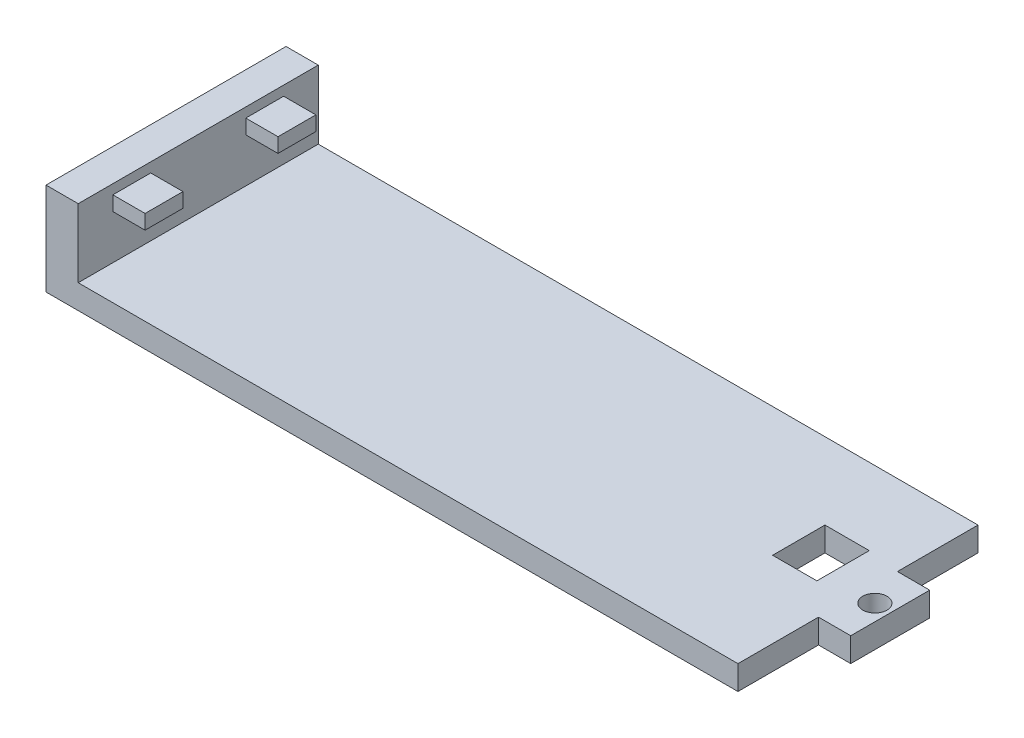
ISO-10303-21;
HEADER;
FILE_DESCRIPTION(('STEP AP214'),'2;1');
FILE_NAME('part.step','',(''),(''),'','','');
FILE_SCHEMA(('AUTOMOTIVE_DESIGN { 1 0 10303 214 1 1 1 1 }'));
ENDSEC;
DATA;
#1=APPLICATION_CONTEXT('core data for automotive mechanical design processes');
#2=APPLICATION_PROTOCOL_DEFINITION('international standard','automotive_design',2000,#1);
#3=PRODUCT_CONTEXT('',#1,'mechanical');
#4=PRODUCT('Part','Part','',(#3));
#5=PRODUCT_RELATED_PRODUCT_CATEGORY('part','',(#4));
#6=PRODUCT_DEFINITION_FORMATION('','',#4);
#7=PRODUCT_DEFINITION_CONTEXT('part definition',#1,'design');
#8=PRODUCT_DEFINITION('design','',#6,#7);
#9=PRODUCT_DEFINITION_SHAPE('','',#8);
#10=(LENGTH_UNIT() NAMED_UNIT(*) SI_UNIT(.MILLI.,.METRE.));
#11=(NAMED_UNIT(*) PLANE_ANGLE_UNIT() SI_UNIT($,.RADIAN.));
#12=(NAMED_UNIT(*) SI_UNIT($,.STERADIAN.) SOLID_ANGLE_UNIT());
#13=UNCERTAINTY_MEASURE_WITH_UNIT(LENGTH_MEASURE(1.E-05),#10,'distance_accuracy_value','');
#14=(GEOMETRIC_REPRESENTATION_CONTEXT(3) GLOBAL_UNCERTAINTY_ASSIGNED_CONTEXT((#13)) GLOBAL_UNIT_ASSIGNED_CONTEXT((#10,
#11,#12)) REPRESENTATION_CONTEXT('',''));
#15=CARTESIAN_POINT('',(0.,0.,0.));
#16=DIRECTION('',(0.,0.,1.));
#17=DIRECTION('',(1.,0.,0.));
#18=AXIS2_PLACEMENT_3D('',#15,#16,#17);
#19=CARTESIAN_POINT('',(4.,11.5,-29.8));
#20=DIRECTION('',(-1.,0.,0.));
#21=DIRECTION('',(0.,0.,1.));
#22=AXIS2_PLACEMENT_3D('',#19,#20,#21);
#23=PLANE('',#22);
#24=DIRECTION('',(0.,-1.,0.));
#25=VECTOR('',#24,1.);
#26=CARTESIAN_POINT('',(4.,8.5,-4.3));
#27=LINE('',#26,#25);
#28=CARTESIAN_POINT('',(4.,10.3,-4.3));
#29=VERTEX_POINT('',#28);
#30=CARTESIAN_POINT('',(4.,8.5,-4.3));
#31=VERTEX_POINT('',#30);
#32=EDGE_CURVE('E202',#29,#31,#27,.T.);
#33=ORIENTED_EDGE('',*,*,#32,.F.);
#34=DIRECTION('',(0.,0.,1.));
#35=VECTOR('',#34,1.);
#36=CARTESIAN_POINT('',(4.,10.3,-4.3));
#37=LINE('',#36,#35);
#38=CARTESIAN_POINT('',(4.,10.3,-9.));
#39=VERTEX_POINT('',#38);
#40=EDGE_CURVE('E215',#39,#29,#37,.T.);
#41=ORIENTED_EDGE('',*,*,#40,.F.);
#42=DIRECTION('',(0.,1.,0.));
#43=VECTOR('',#42,1.);
#44=CARTESIAN_POINT('',(4.,8.5,-9.));
#45=LINE('',#44,#43);
#46=CARTESIAN_POINT('',(4.,8.5,-9.));
#47=VERTEX_POINT('',#46);
#48=EDGE_CURVE('E224',#47,#39,#45,.T.);
#49=ORIENTED_EDGE('',*,*,#48,.F.);
#50=DIRECTION('',(0.,0.,-1.));
#51=VECTOR('',#50,1.);
#52=CARTESIAN_POINT('',(4.,8.5,-4.3));
#53=LINE('',#52,#51);
#54=EDGE_CURVE('E205',#31,#47,#53,.T.);
#55=ORIENTED_EDGE('',*,*,#54,.F.);
#56=EDGE_LOOP('',(#33,#41,#49,#55));
#57=FACE_BOUND('',#56,.T.);
#58=DIRECTION('',(0.,0.,-1.));
#59=VECTOR('',#58,1.);
#60=CARTESIAN_POINT('',(4.,3.,-29.8));
#61=LINE('',#60,#59);
#62=CARTESIAN_POINT('',(4.,3.,0.));
#63=VERTEX_POINT('',#62);
#64=CARTESIAN_POINT('',(4.,3.,-29.8));
#65=VERTEX_POINT('',#64);
#66=EDGE_CURVE('E240',#63,#65,#61,.T.);
#67=ORIENTED_EDGE('',*,*,#66,.T.);
#68=DIRECTION('',(0.,-1.,0.));
#69=VECTOR('',#68,1.);
#70=CARTESIAN_POINT('',(4.,11.5,-29.8));
#71=LINE('',#70,#69);
#72=CARTESIAN_POINT('',(4.,11.5,-29.8));
#73=VERTEX_POINT('',#72);
#74=EDGE_CURVE('E251',#73,#65,#71,.T.);
#75=ORIENTED_EDGE('',*,*,#74,.F.);
#76=DIRECTION('',(0.,0.,-1.));
#77=VECTOR('',#76,1.);
#78=CARTESIAN_POINT('',(4.,11.5,-29.8));
#79=LINE('',#78,#77);
#80=CARTESIAN_POINT('',(4.,11.5,0.));
#81=VERTEX_POINT('',#80);
#82=EDGE_CURVE('E246',#81,#73,#79,.T.);
#83=ORIENTED_EDGE('',*,*,#82,.F.);
#84=DIRECTION('',(0.,-1.,0.));
#85=VECTOR('',#84,1.);
#86=CARTESIAN_POINT('',(4.,11.5,0.));
#87=LINE('',#86,#85);
#88=EDGE_CURVE('E256',#81,#63,#87,.T.);
#89=ORIENTED_EDGE('',*,*,#88,.T.);
#90=EDGE_LOOP('',(#67,#75,#83,#89));
#91=FACE_BOUND('',#90,.T.);
#92=DIRECTION('',(0.,-1.,0.));
#93=VECTOR('',#92,1.);
#94=CARTESIAN_POINT('',(4.,8.5,-20.8));
#95=LINE('',#94,#93);
#96=CARTESIAN_POINT('',(4.,10.3,-20.8));
#97=VERTEX_POINT('',#96);
#98=CARTESIAN_POINT('',(4.,8.5,-20.8));
#99=VERTEX_POINT('',#98);
#100=EDGE_CURVE('E201',#97,#99,#95,.T.);
#101=ORIENTED_EDGE('',*,*,#100,.F.);
#102=DIRECTION('',(0.,0.,1.));
#103=VECTOR('',#102,1.);
#104=CARTESIAN_POINT('',(4.,10.3,-20.8));
#105=LINE('',#104,#103);
#106=CARTESIAN_POINT('',(4.,10.3,-25.5));
#107=VERTEX_POINT('',#106);
#108=EDGE_CURVE('E198',#107,#97,#105,.T.);
#109=ORIENTED_EDGE('',*,*,#108,.F.);
#110=DIRECTION('',(0.,1.,0.));
#111=VECTOR('',#110,1.);
#112=CARTESIAN_POINT('',(4.,8.5,-25.5));
#113=LINE('',#112,#111);
#114=CARTESIAN_POINT('',(4.,8.5,-25.5));
#115=VERTEX_POINT('',#114);
#116=EDGE_CURVE('E52',#115,#107,#113,.T.);
#117=ORIENTED_EDGE('',*,*,#116,.F.);
#118=DIRECTION('',(0.,0.,-1.));
#119=VECTOR('',#118,1.);
#120=CARTESIAN_POINT('',(4.,8.5,-20.8));
#121=LINE('',#120,#119);
#122=EDGE_CURVE('E47',#99,#115,#121,.T.);
#123=ORIENTED_EDGE('',*,*,#122,.F.);
#124=EDGE_LOOP('',(#101,#109,#117,#123));
#125=FACE_BOUND('',#124,.T.);
#126=ADVANCED_FACE('F32',(#57,#91,#125),#23,.F.);
#127=CARTESIAN_POINT('',(0.,3.,-29.8));
#128=DIRECTION('',(1.,0.,0.));
#129=DIRECTION('',(0.,0.,-1.));
#130=AXIS2_PLACEMENT_3D('',#127,#128,#129);
#131=PLANE('',#130);
#132=DIRECTION('',(0.,0.,1.));
#133=VECTOR('',#132,1.);
#134=CARTESIAN_POINT('',(0.,0.,-29.8));
#135=LINE('',#134,#133);
#136=CARTESIAN_POINT('',(0.,0.,-29.8));
#137=VERTEX_POINT('',#136);
#138=CARTESIAN_POINT('',(0.,0.,0.));
#139=VERTEX_POINT('',#138);
#140=EDGE_CURVE('E327',#137,#139,#135,.T.);
#141=ORIENTED_EDGE('',*,*,#140,.T.);
#142=DIRECTION('',(0.,-1.,0.));
#143=VECTOR('',#142,1.);
#144=CARTESIAN_POINT('',(0.,3.,0.));
#145=LINE('',#144,#143);
#146=CARTESIAN_POINT('',(0.,11.5,0.));
#147=VERTEX_POINT('',#146);
#148=EDGE_CURVE('E11',#147,#139,#145,.T.);
#149=ORIENTED_EDGE('',*,*,#148,.F.);
#150=DIRECTION('',(0.,0.,1.));
#151=VECTOR('',#150,1.);
#152=CARTESIAN_POINT('',(0.,11.5,-29.8));
#153=LINE('',#152,#151);
#154=CARTESIAN_POINT('',(0.,11.5,-29.8));
#155=VERTEX_POINT('',#154);
#156=EDGE_CURVE('E241',#155,#147,#153,.T.);
#157=ORIENTED_EDGE('',*,*,#156,.F.);
#158=DIRECTION('',(0.,-1.,0.));
#159=VECTOR('',#158,1.);
#160=CARTESIAN_POINT('',(0.,3.,-29.8));
#161=LINE('',#160,#159);
#162=EDGE_CURVE('E40',#155,#137,#161,.T.);
#163=ORIENTED_EDGE('',*,*,#162,.T.);
#164=EDGE_LOOP('',(#141,#149,#157,#163));
#165=FACE_BOUND('',#164,.T.);
#166=ADVANCED_FACE('F34',(#165),#131,.F.);
#167=CARTESIAN_POINT('',(0.,3.,0.));
#168=DIRECTION('',(0.,0.,-1.));
#169=DIRECTION('',(-1.,0.,0.));
#170=AXIS2_PLACEMENT_3D('',#167,#168,#169);
#171=PLANE('',#170);
#172=DIRECTION('',(1.,0.,0.));
#173=VECTOR('',#172,1.);
#174=CARTESIAN_POINT('',(0.,0.,0.));
#175=LINE('',#174,#173);
#176=CARTESIAN_POINT('',(85.9,0.,0.));
#177=VERTEX_POINT('',#176);
#178=EDGE_CURVE('E338',#139,#177,#175,.T.);
#179=ORIENTED_EDGE('',*,*,#178,.T.);
#180=DIRECTION('',(0.,-1.,0.));
#181=VECTOR('',#180,1.);
#182=CARTESIAN_POINT('',(85.9,5.,0.));
#183=LINE('',#182,#181);
#184=CARTESIAN_POINT('',(85.9,3.,0.));
#185=VERTEX_POINT('',#184);
#186=EDGE_CURVE('E315',#185,#177,#183,.T.);
#187=ORIENTED_EDGE('',*,*,#186,.F.);
#188=DIRECTION('',(1.,0.,0.));
#189=VECTOR('',#188,1.);
#190=CARTESIAN_POINT('',(0.,3.,0.));
#191=LINE('',#190,#189);
#192=EDGE_CURVE('E328',#63,#185,#191,.T.);
#193=ORIENTED_EDGE('',*,*,#192,.F.);
#194=ORIENTED_EDGE('',*,*,#88,.F.);
#195=DIRECTION('',(1.,0.,0.));
#196=VECTOR('',#195,1.);
#197=CARTESIAN_POINT('',(0.,11.5,0.));
#198=LINE('',#197,#196);
#199=EDGE_CURVE('E244',#147,#81,#198,.T.);
#200=ORIENTED_EDGE('',*,*,#199,.F.);
#201=ORIENTED_EDGE('',*,*,#148,.T.);
#202=EDGE_LOOP('',(#179,#187,#193,#194,#200,#201));
#203=FACE_BOUND('',#202,.T.);
#204=ADVANCED_FACE('F359',(#203),#171,.F.);
#205=CARTESIAN_POINT('',(89.9,3.,0.));
#206=DIRECTION('',(-1.,0.,0.));
#207=DIRECTION('',(0.,0.,1.));
#208=AXIS2_PLACEMENT_3D('',#205,#206,#207);
#209=PLANE('',#208);
#210=DIRECTION('',(0.,0.,-1.));
#211=VECTOR('',#210,1.);
#212=CARTESIAN_POINT('',(89.9,0.,0.));
#213=LINE('',#212,#211);
#214=CARTESIAN_POINT('',(89.9,0.,-10.));
#215=VERTEX_POINT('',#214);
#216=CARTESIAN_POINT('',(89.9,0.,-19.8));
#217=VERTEX_POINT('',#216);
#218=EDGE_CURVE('E341',#215,#217,#213,.T.);
#219=ORIENTED_EDGE('',*,*,#218,.T.);
#220=DIRECTION('',(0.,-1.,0.));
#221=VECTOR('',#220,1.);
#222=CARTESIAN_POINT('',(89.9,5.,-19.8));
#223=LINE('',#222,#221);
#224=CARTESIAN_POINT('',(89.9,3.,-19.8));
#225=VERTEX_POINT('',#224);
#226=EDGE_CURVE('E294',#225,#217,#223,.T.);
#227=ORIENTED_EDGE('',*,*,#226,.F.);
#228=DIRECTION('',(0.,0.,-1.));
#229=VECTOR('',#228,1.);
#230=CARTESIAN_POINT('',(89.9,3.,0.));
#231=LINE('',#230,#229);
#232=CARTESIAN_POINT('',(89.9,3.,-10.));
#233=VERTEX_POINT('',#232);
#234=EDGE_CURVE('E330',#233,#225,#231,.T.);
#235=ORIENTED_EDGE('',*,*,#234,.F.);
#236=DIRECTION('',(0.,-1.,0.));
#237=VECTOR('',#236,1.);
#238=CARTESIAN_POINT('',(89.9,5.,-10.));
#239=LINE('',#238,#237);
#240=EDGE_CURVE('E316',#233,#215,#239,.T.);
#241=ORIENTED_EDGE('',*,*,#240,.T.);
#242=EDGE_LOOP('',(#219,#227,#235,#241));
#243=FACE_BOUND('',#242,.T.);
#244=ADVANCED_FACE('F383',(#243),#209,.F.);
#245=CARTESIAN_POINT('',(0.,3.,-29.8));
#246=DIRECTION('',(0.,0.,1.));
#247=DIRECTION('',(1.,0.,0.));
#248=AXIS2_PLACEMENT_3D('',#245,#246,#247);
#249=PLANE('',#248);
#250=DIRECTION('',(-1.,0.,0.));
#251=VECTOR('',#250,1.);
#252=CARTESIAN_POINT('',(0.,3.,-29.8));
#253=LINE('',#252,#251);
#254=CARTESIAN_POINT('',(85.9,3.,-29.8));
#255=VERTEX_POINT('',#254);
#256=EDGE_CURVE('E334',#255,#65,#253,.T.);
#257=ORIENTED_EDGE('',*,*,#256,.F.);
#258=DIRECTION('',(0.,-1.,0.));
#259=VECTOR('',#258,1.);
#260=CARTESIAN_POINT('',(85.9,5.,-29.8));
#261=LINE('',#260,#259);
#262=CARTESIAN_POINT('',(85.9,0.,-29.8));
#263=VERTEX_POINT('',#262);
#264=EDGE_CURVE('E295',#255,#263,#261,.T.);
#265=ORIENTED_EDGE('',*,*,#264,.T.);
#266=DIRECTION('',(-1.,0.,0.));
#267=VECTOR('',#266,1.);
#268=CARTESIAN_POINT('',(0.,0.,-29.8));
#269=LINE('',#268,#267);
#270=EDGE_CURVE('E331',#263,#137,#269,.T.);
#271=ORIENTED_EDGE('',*,*,#270,.T.);
#272=ORIENTED_EDGE('',*,*,#162,.F.);
#273=DIRECTION('',(-1.,0.,0.));
#274=VECTOR('',#273,1.);
#275=CARTESIAN_POINT('',(0.,11.5,-29.8));
#276=LINE('',#275,#274);
#277=EDGE_CURVE('E248',#73,#155,#276,.T.);
#278=ORIENTED_EDGE('',*,*,#277,.F.);
#279=ORIENTED_EDGE('',*,*,#74,.T.);
#280=EDGE_LOOP('',(#257,#265,#271,#272,#278,#279));
#281=FACE_BOUND('',#280,.T.);
#282=ADVANCED_FACE('F367',(#281),#249,.F.);
#283=CARTESIAN_POINT('',(0.,3.,0.));
#284=DIRECTION('',(0.,1.,0.));
#285=DIRECTION('',(0.,0.,1.));
#286=AXIS2_PLACEMENT_3D('',#283,#284,#285);
#287=PLANE('',#286);
#288=ORIENTED_EDGE('',*,*,#66,.F.);
#289=ORIENTED_EDGE('',*,*,#192,.T.);
#290=DIRECTION('',(0.,0.,1.));
#291=VECTOR('',#290,1.);
#292=CARTESIAN_POINT('',(85.9,3.,0.));
#293=LINE('',#292,#291);
#294=CARTESIAN_POINT('',(85.9,3.,-10.));
#295=VERTEX_POINT('',#294);
#296=EDGE_CURVE('E319',#295,#185,#293,.T.);
#297=ORIENTED_EDGE('',*,*,#296,.F.);
#298=DIRECTION('',(-1.,0.,0.));
#299=VECTOR('',#298,1.);
#300=CARTESIAN_POINT('',(0.,3.,-10.));
#301=LINE('',#300,#299);
#302=EDGE_CURVE('E325',#233,#295,#301,.T.);
#303=ORIENTED_EDGE('',*,*,#302,.F.);
#304=ORIENTED_EDGE('',*,*,#234,.T.);
#305=DIRECTION('',(1.,0.,0.));
#306=VECTOR('',#305,1.);
#307=CARTESIAN_POINT('',(0.,3.,-19.7999999999999));
#308=LINE('',#307,#306);
#309=CARTESIAN_POINT('',(85.9,3.,-19.8));
#310=VERTEX_POINT('',#309);
#311=EDGE_CURVE('E306',#310,#225,#308,.T.);
#312=ORIENTED_EDGE('',*,*,#311,.F.);
#313=DIRECTION('',(0.,0.,1.));
#314=VECTOR('',#313,1.);
#315=CARTESIAN_POINT('',(85.9,3.,0.));
#316=LINE('',#315,#314);
#317=EDGE_CURVE('E308',#255,#310,#316,.T.);
#318=ORIENTED_EDGE('',*,*,#317,.F.);
#319=ORIENTED_EDGE('',*,*,#256,.T.);
#320=EDGE_LOOP('',(#288,#289,#297,#303,#304,#312,#318,#319));
#321=FACE_BOUND('',#320,.T.);
#322=DIRECTION('',(0.,0.,1.));
#323=VECTOR('',#322,1.);
#324=CARTESIAN_POINT('',(76.4,3.,0.));
#325=LINE('',#324,#323);
#326=CARTESIAN_POINT('',(76.4,3.,-20.3));
#327=VERTEX_POINT('',#326);
#328=CARTESIAN_POINT('',(76.4,3.,-13.8));
#329=VERTEX_POINT('',#328);
#330=EDGE_CURVE('E286',#327,#329,#325,.T.);
#331=ORIENTED_EDGE('',*,*,#330,.F.);
#332=DIRECTION('',(-1.,0.,0.));
#333=VECTOR('',#332,1.);
#334=CARTESIAN_POINT('',(0.,3.,-20.3));
#335=LINE('',#334,#333);
#336=CARTESIAN_POINT('',(81.9,3.,-20.3));
#337=VERTEX_POINT('',#336);
#338=EDGE_CURVE('E273',#337,#327,#335,.T.);
#339=ORIENTED_EDGE('',*,*,#338,.F.);
#340=DIRECTION('',(0.,0.,-1.));
#341=VECTOR('',#340,1.);
#342=CARTESIAN_POINT('',(81.9,3.,1.74860126378462E-13));
#343=LINE('',#342,#341);
#344=CARTESIAN_POINT('',(81.9,3.,-13.8));
#345=VERTEX_POINT('',#344);
#346=EDGE_CURVE('E281',#345,#337,#343,.T.);
#347=ORIENTED_EDGE('',*,*,#346,.F.);
#348=DIRECTION('',(1.,0.,0.));
#349=VECTOR('',#348,1.);
#350=CARTESIAN_POINT('',(0.,3.,-13.8));
#351=LINE('',#350,#349);
#352=EDGE_CURVE('E284',#329,#345,#351,.T.);
#353=ORIENTED_EDGE('',*,*,#352,.F.);
#354=EDGE_LOOP('',(#331,#339,#347,#353));
#355=FACE_BOUND('',#354,.T.);
#356=CARTESIAN_POINT('',(87.9,3.,-15.));
#357=DIRECTION('',(0.,1.,0.));
#358=DIRECTION('',(0.,0.,1.));
#359=AXIS2_PLACEMENT_3D('',#356,#357,#358);
#360=CIRCLE('',#359,1.5);
#361=CARTESIAN_POINT('',(87.9,3.,-13.5));
#362=VERTEX_POINT('',#361);
#363=EDGE_CURVE('E298',#362,#362,#360,.T.);
#364=ORIENTED_EDGE('',*,*,#363,.F.);
#365=EDGE_LOOP('',(#364));
#366=FACE_BOUND('',#365,.T.);
#367=ADVANCED_FACE('F370',(#321,#355,#366),#287,.T.);
#368=CARTESIAN_POINT('',(0.,0.,0.));
#369=DIRECTION('',(0.,1.,0.));
#370=DIRECTION('',(0.,0.,1.));
#371=AXIS2_PLACEMENT_3D('',#368,#369,#370);
#372=PLANE('',#371);
#373=DIRECTION('',(1.,0.,0.));
#374=VECTOR('',#373,1.);
#375=CARTESIAN_POINT('',(76.4,0.,-20.3));
#376=LINE('',#375,#374);
#377=CARTESIAN_POINT('',(76.4,0.,-20.3));
#378=VERTEX_POINT('',#377);
#379=CARTESIAN_POINT('',(81.9,0.,-20.3));
#380=VERTEX_POINT('',#379);
#381=EDGE_CURVE('E261',#378,#380,#376,.T.);
#382=ORIENTED_EDGE('',*,*,#381,.F.);
#383=DIRECTION('',(0.,0.,-1.));
#384=VECTOR('',#383,1.);
#385=CARTESIAN_POINT('',(76.4,0.,-13.8));
#386=LINE('',#385,#384);
#387=CARTESIAN_POINT('',(76.4,0.,-13.8));
#388=VERTEX_POINT('',#387);
#389=EDGE_CURVE('E259',#388,#378,#386,.T.);
#390=ORIENTED_EDGE('',*,*,#389,.F.);
#391=DIRECTION('',(-1.,0.,0.));
#392=VECTOR('',#391,1.);
#393=CARTESIAN_POINT('',(76.4,0.,-13.8));
#394=LINE('',#393,#392);
#395=CARTESIAN_POINT('',(81.9,0.,-13.8));
#396=VERTEX_POINT('',#395);
#397=EDGE_CURVE('E267',#396,#388,#394,.T.);
#398=ORIENTED_EDGE('',*,*,#397,.F.);
#399=DIRECTION('',(0.,0.,1.));
#400=VECTOR('',#399,1.);
#401=CARTESIAN_POINT('',(81.9,0.,-13.8));
#402=LINE('',#401,#400);
#403=EDGE_CURVE('E264',#380,#396,#402,.T.);
#404=ORIENTED_EDGE('',*,*,#403,.F.);
#405=EDGE_LOOP('',(#382,#390,#398,#404));
#406=FACE_BOUND('',#405,.T.);
#407=CARTESIAN_POINT('',(87.9,0.,-15.));
#408=DIRECTION('',(0.,-1.,0.));
#409=DIRECTION('',(0.,0.,-1.));
#410=AXIS2_PLACEMENT_3D('',#407,#408,#409);
#411=CIRCLE('',#410,1.5);
#412=CARTESIAN_POINT('',(87.9,0.,-16.5));
#413=VERTEX_POINT('',#412);
#414=EDGE_CURVE('E288',#413,#413,#411,.T.);
#415=ORIENTED_EDGE('',*,*,#414,.F.);
#416=EDGE_LOOP('',(#415));
#417=FACE_BOUND('',#416,.T.);
#418=ORIENTED_EDGE('',*,*,#270,.F.);
#419=DIRECTION('',(0.,0.,-1.));
#420=VECTOR('',#419,1.);
#421=CARTESIAN_POINT('',(85.9,0.,-29.8));
#422=LINE('',#421,#420);
#423=CARTESIAN_POINT('',(85.9,0.,-19.8));
#424=VERTEX_POINT('',#423);
#425=EDGE_CURVE('E292',#424,#263,#422,.T.);
#426=ORIENTED_EDGE('',*,*,#425,.F.);
#427=DIRECTION('',(-1.,0.,0.));
#428=VECTOR('',#427,1.);
#429=CARTESIAN_POINT('',(89.9,0.,-19.8));
#430=LINE('',#429,#428);
#431=EDGE_CURVE('E289',#217,#424,#430,.T.);
#432=ORIENTED_EDGE('',*,*,#431,.F.);
#433=ORIENTED_EDGE('',*,*,#218,.F.);
#434=DIRECTION('',(1.,0.,0.));
#435=VECTOR('',#434,1.);
#436=CARTESIAN_POINT('',(89.9,0.,-10.));
#437=LINE('',#436,#435);
#438=CARTESIAN_POINT('',(85.9,0.,-10.));
#439=VERTEX_POINT('',#438);
#440=EDGE_CURVE('E313',#439,#215,#437,.T.);
#441=ORIENTED_EDGE('',*,*,#440,.F.);
#442=DIRECTION('',(0.,0.,-1.));
#443=VECTOR('',#442,1.);
#444=CARTESIAN_POINT('',(85.9,0.,0.));
#445=LINE('',#444,#443);
#446=EDGE_CURVE('E310',#177,#439,#445,.T.);
#447=ORIENTED_EDGE('',*,*,#446,.F.);
#448=ORIENTED_EDGE('',*,*,#178,.F.);
#449=ORIENTED_EDGE('',*,*,#140,.F.);
#450=EDGE_LOOP('',(#418,#426,#432,#433,#441,#447,#448,#449));
#451=FACE_BOUND('',#450,.T.);
#452=ADVANCED_FACE('F352',(#406,#417,#451),#372,.F.);
#453=CARTESIAN_POINT('',(89.9,5.,-10.));
#454=DIRECTION('',(0.,0.,-1.));
#455=DIRECTION('',(-1.,0.,0.));
#456=AXIS2_PLACEMENT_3D('',#453,#454,#455);
#457=PLANE('',#456);
#458=ORIENTED_EDGE('',*,*,#302,.T.);
#459=DIRECTION('',(0.,-1.,0.));
#460=VECTOR('',#459,1.);
#461=CARTESIAN_POINT('',(85.9,5.,-10.));
#462=LINE('',#461,#460);
#463=EDGE_CURVE('E320',#295,#439,#462,.T.);
#464=ORIENTED_EDGE('',*,*,#463,.T.);
#465=ORIENTED_EDGE('',*,*,#440,.T.);
#466=ORIENTED_EDGE('',*,*,#240,.F.);
#467=EDGE_LOOP('',(#458,#464,#465,#466));
#468=FACE_BOUND('',#467,.T.);
#469=ADVANCED_FACE('F442',(#468),#457,.F.);
#470=CARTESIAN_POINT('',(85.9,5.,0.));
#471=DIRECTION('',(-1.,0.,0.));
#472=DIRECTION('',(0.,0.,1.));
#473=AXIS2_PLACEMENT_3D('',#470,#471,#472);
#474=PLANE('',#473);
#475=ORIENTED_EDGE('',*,*,#296,.T.);
#476=ORIENTED_EDGE('',*,*,#186,.T.);
#477=ORIENTED_EDGE('',*,*,#446,.T.);
#478=ORIENTED_EDGE('',*,*,#463,.F.);
#479=EDGE_LOOP('',(#475,#476,#477,#478));
#480=FACE_BOUND('',#479,.T.);
#481=ADVANCED_FACE('F375',(#480),#474,.F.);
#482=CARTESIAN_POINT('',(87.9,5.,-15.));
#483=DIRECTION('',(0.,-1.,0.));
#484=DIRECTION('',(0.,0.,-1.));
#485=AXIS2_PLACEMENT_3D('',#482,#483,#484);
#486=CYLINDRICAL_SURFACE('',#485,1.5);
#487=ORIENTED_EDGE('',*,*,#363,.T.);
#488=EDGE_LOOP('',(#487));
#489=FACE_BOUND('',#488,.T.);
#490=ORIENTED_EDGE('',*,*,#414,.T.);
#491=EDGE_LOOP('',(#490));
#492=FACE_BOUND('',#491,.T.);
#493=ADVANCED_FACE('F392',(#489,#492),#486,.F.);
#494=CARTESIAN_POINT('',(85.9,5.,-29.8));
#495=DIRECTION('',(-1.,0.,0.));
#496=DIRECTION('',(0.,0.,1.));
#497=AXIS2_PLACEMENT_3D('',#494,#495,#496);
#498=PLANE('',#497);
#499=ORIENTED_EDGE('',*,*,#317,.T.);
#500=DIRECTION('',(0.,-1.,0.));
#501=VECTOR('',#500,1.);
#502=CARTESIAN_POINT('',(85.9,5.,-19.8));
#503=LINE('',#502,#501);
#504=EDGE_CURVE('E299',#310,#424,#503,.T.);
#505=ORIENTED_EDGE('',*,*,#504,.T.);
#506=ORIENTED_EDGE('',*,*,#425,.T.);
#507=ORIENTED_EDGE('',*,*,#264,.F.);
#508=EDGE_LOOP('',(#499,#505,#506,#507));
#509=FACE_BOUND('',#508,.T.);
#510=ADVANCED_FACE('F390',(#509),#498,.F.);
#511=CARTESIAN_POINT('',(89.9,5.,-19.8));
#512=DIRECTION('',(0.,0.,1.));
#513=DIRECTION('',(1.,0.,0.));
#514=AXIS2_PLACEMENT_3D('',#511,#512,#513);
#515=PLANE('',#514);
#516=ORIENTED_EDGE('',*,*,#311,.T.);
#517=ORIENTED_EDGE('',*,*,#226,.T.);
#518=ORIENTED_EDGE('',*,*,#431,.T.);
#519=ORIENTED_EDGE('',*,*,#504,.F.);
#520=EDGE_LOOP('',(#516,#517,#518,#519));
#521=FACE_BOUND('',#520,.T.);
#522=ADVANCED_FACE('F387',(#521),#515,.F.);
#523=CARTESIAN_POINT('',(76.4,10.,-13.8));
#524=DIRECTION('',(-1.,0.,0.));
#525=DIRECTION('',(0.,0.,1.));
#526=AXIS2_PLACEMENT_3D('',#523,#524,#525);
#527=PLANE('',#526);
#528=ORIENTED_EDGE('',*,*,#330,.T.);
#529=DIRECTION('',(0.,-1.,0.));
#530=VECTOR('',#529,1.);
#531=CARTESIAN_POINT('',(76.4,10.,-13.8));
#532=LINE('',#531,#530);
#533=EDGE_CURVE('E271',#329,#388,#532,.T.);
#534=ORIENTED_EDGE('',*,*,#533,.T.);
#535=ORIENTED_EDGE('',*,*,#389,.T.);
#536=DIRECTION('',(0.,-1.,0.));
#537=VECTOR('',#536,1.);
#538=CARTESIAN_POINT('',(76.4,10.,-20.3));
#539=LINE('',#538,#537);
#540=EDGE_CURVE('E270',#327,#378,#539,.T.);
#541=ORIENTED_EDGE('',*,*,#540,.F.);
#542=EDGE_LOOP('',(#528,#534,#535,#541));
#543=FACE_BOUND('',#542,.T.);
#544=ADVANCED_FACE('F398',(#543),#527,.F.);
#545=CARTESIAN_POINT('',(76.4,10.,-13.8));
#546=DIRECTION('',(0.,0.,1.));
#547=DIRECTION('',(1.,0.,0.));
#548=AXIS2_PLACEMENT_3D('',#545,#546,#547);
#549=PLANE('',#548);
#550=ORIENTED_EDGE('',*,*,#352,.T.);
#551=DIRECTION('',(0.,-1.,0.));
#552=VECTOR('',#551,1.);
#553=CARTESIAN_POINT('',(81.9,10.,-13.8));
#554=LINE('',#553,#552);
#555=EDGE_CURVE('E274',#345,#396,#554,.T.);
#556=ORIENTED_EDGE('',*,*,#555,.T.);
#557=ORIENTED_EDGE('',*,*,#397,.T.);
#558=ORIENTED_EDGE('',*,*,#533,.F.);
#559=EDGE_LOOP('',(#550,#556,#557,#558));
#560=FACE_BOUND('',#559,.T.);
#561=ADVANCED_FACE('F412',(#560),#549,.F.);
#562=CARTESIAN_POINT('',(81.9,10.,-13.8));
#563=DIRECTION('',(1.,0.,0.));
#564=DIRECTION('',(0.,0.,-1.));
#565=AXIS2_PLACEMENT_3D('',#562,#563,#564);
#566=PLANE('',#565);
#567=ORIENTED_EDGE('',*,*,#346,.T.);
#568=DIRECTION('',(0.,-1.,0.));
#569=VECTOR('',#568,1.);
#570=CARTESIAN_POINT('',(81.9,10.,-20.3));
#571=LINE('',#570,#569);
#572=EDGE_CURVE('E276',#337,#380,#571,.T.);
#573=ORIENTED_EDGE('',*,*,#572,.T.);
#574=ORIENTED_EDGE('',*,*,#403,.T.);
#575=ORIENTED_EDGE('',*,*,#555,.F.);
#576=EDGE_LOOP('',(#567,#573,#574,#575));
#577=FACE_BOUND('',#576,.T.);
#578=ADVANCED_FACE('F415',(#577),#566,.F.);
#579=CARTESIAN_POINT('',(76.4,10.,-20.3));
#580=DIRECTION('',(0.,0.,-1.));
#581=DIRECTION('',(-1.,0.,0.));
#582=AXIS2_PLACEMENT_3D('',#579,#580,#581);
#583=PLANE('',#582);
#584=ORIENTED_EDGE('',*,*,#338,.T.);
#585=ORIENTED_EDGE('',*,*,#540,.T.);
#586=ORIENTED_EDGE('',*,*,#381,.T.);
#587=ORIENTED_EDGE('',*,*,#572,.F.);
#588=EDGE_LOOP('',(#584,#585,#586,#587));
#589=FACE_BOUND('',#588,.T.);
#590=ADVANCED_FACE('F419',(#589),#583,.F.);
#591=CARTESIAN_POINT('',(0.,11.5,0.));
#592=DIRECTION('',(0.,1.,0.));
#593=DIRECTION('',(0.,0.,1.));
#594=AXIS2_PLACEMENT_3D('',#591,#592,#593);
#595=PLANE('',#594);
#596=ORIENTED_EDGE('',*,*,#156,.T.);
#597=ORIENTED_EDGE('',*,*,#199,.T.);
#598=ORIENTED_EDGE('',*,*,#82,.T.);
#599=ORIENTED_EDGE('',*,*,#277,.T.);
#600=EDGE_LOOP('',(#596,#597,#598,#599));
#601=FACE_BOUND('',#600,.T.);
#602=ADVANCED_FACE('F364',(#601),#595,.T.);
#603=CARTESIAN_POINT('',(8.,8.5,-4.3));
#604=DIRECTION('',(0.,0.,-1.));
#605=DIRECTION('',(-1.,0.,0.));
#606=AXIS2_PLACEMENT_3D('',#603,#604,#605);
#607=PLANE('',#606);
#608=ORIENTED_EDGE('',*,*,#32,.T.);
#609=DIRECTION('',(-1.,0.,0.));
#610=VECTOR('',#609,1.);
#611=CARTESIAN_POINT('',(8.,8.5,-4.3));
#612=LINE('',#611,#610);
#613=CARTESIAN_POINT('',(8.,8.5,-4.3));
#614=VERTEX_POINT('',#613);
#615=EDGE_CURVE('E237',#614,#31,#612,.T.);
#616=ORIENTED_EDGE('',*,*,#615,.F.);
#617=DIRECTION('',(0.,-1.,0.));
#618=VECTOR('',#617,1.);
#619=CARTESIAN_POINT('',(8.,8.5,-4.3));
#620=LINE('',#619,#618);
#621=CARTESIAN_POINT('',(8.,10.3,-4.3));
#622=VERTEX_POINT('',#621);
#623=EDGE_CURVE('E211',#622,#614,#620,.T.);
#624=ORIENTED_EDGE('',*,*,#623,.F.);
#625=DIRECTION('',(-1.,0.,0.));
#626=VECTOR('',#625,1.);
#627=CARTESIAN_POINT('',(8.,10.3,-4.3));
#628=LINE('',#627,#626);
#629=EDGE_CURVE('E220',#622,#29,#628,.T.);
#630=ORIENTED_EDGE('',*,*,#629,.T.);
#631=EDGE_LOOP('',(#608,#616,#624,#630));
#632=FACE_BOUND('',#631,.T.);
#633=ADVANCED_FACE('F485',(#632),#607,.F.);
#634=CARTESIAN_POINT('',(8.,8.5,-4.3));
#635=DIRECTION('',(0.,1.,0.));
#636=DIRECTION('',(0.,0.,1.));
#637=AXIS2_PLACEMENT_3D('',#634,#635,#636);
#638=PLANE('',#637);
#639=ORIENTED_EDGE('',*,*,#54,.T.);
#640=DIRECTION('',(-1.,0.,0.));
#641=VECTOR('',#640,1.);
#642=CARTESIAN_POINT('',(8.,8.5,-9.));
#643=LINE('',#642,#641);
#644=CARTESIAN_POINT('',(8.,8.5,-9.));
#645=VERTEX_POINT('',#644);
#646=EDGE_CURVE('E234',#645,#47,#643,.T.);
#647=ORIENTED_EDGE('',*,*,#646,.F.);
#648=DIRECTION('',(0.,0.,-1.));
#649=VECTOR('',#648,1.);
#650=CARTESIAN_POINT('',(8.,8.5,-4.3));
#651=LINE('',#650,#649);
#652=EDGE_CURVE('E214',#614,#645,#651,.T.);
#653=ORIENTED_EDGE('',*,*,#652,.F.);
#654=ORIENTED_EDGE('',*,*,#615,.T.);
#655=EDGE_LOOP('',(#639,#647,#653,#654));
#656=FACE_BOUND('',#655,.T.);
#657=ADVANCED_FACE('F498',(#656),#638,.F.);
#658=CARTESIAN_POINT('',(8.,8.5,-9.));
#659=DIRECTION('',(0.,0.,1.));
#660=DIRECTION('',(1.,0.,0.));
#661=AXIS2_PLACEMENT_3D('',#658,#659,#660);
#662=PLANE('',#661);
#663=ORIENTED_EDGE('',*,*,#48,.T.);
#664=DIRECTION('',(-1.,0.,0.));
#665=VECTOR('',#664,1.);
#666=CARTESIAN_POINT('',(8.,10.3,-9.));
#667=LINE('',#666,#665);
#668=CARTESIAN_POINT('',(8.,10.3,-9.));
#669=VERTEX_POINT('',#668);
#670=EDGE_CURVE('E231',#669,#39,#667,.T.);
#671=ORIENTED_EDGE('',*,*,#670,.F.);
#672=DIRECTION('',(0.,1.,0.));
#673=VECTOR('',#672,1.);
#674=CARTESIAN_POINT('',(8.,8.5,-9.));
#675=LINE('',#674,#673);
#676=EDGE_CURVE('E217',#645,#669,#675,.T.);
#677=ORIENTED_EDGE('',*,*,#676,.F.);
#678=ORIENTED_EDGE('',*,*,#646,.T.);
#679=EDGE_LOOP('',(#663,#671,#677,#678));
#680=FACE_BOUND('',#679,.T.);
#681=ADVANCED_FACE('F507',(#680),#662,.F.);
#682=CARTESIAN_POINT('',(8.,10.3,-4.3));
#683=DIRECTION('',(0.,-1.,0.));
#684=DIRECTION('',(0.,0.,-1.));
#685=AXIS2_PLACEMENT_3D('',#682,#683,#684);
#686=PLANE('',#685);
#687=ORIENTED_EDGE('',*,*,#40,.T.);
#688=ORIENTED_EDGE('',*,*,#629,.F.);
#689=DIRECTION('',(0.,0.,1.));
#690=VECTOR('',#689,1.);
#691=CARTESIAN_POINT('',(8.,10.3,-4.3));
#692=LINE('',#691,#690);
#693=EDGE_CURVE('E219',#669,#622,#692,.T.);
#694=ORIENTED_EDGE('',*,*,#693,.F.);
#695=ORIENTED_EDGE('',*,*,#670,.T.);
#696=EDGE_LOOP('',(#687,#688,#694,#695));
#697=FACE_BOUND('',#696,.T.);
#698=ADVANCED_FACE('F517',(#697),#686,.F.);
#699=CARTESIAN_POINT('',(8.,0.,0.));
#700=DIRECTION('',(-1.,0.,0.));
#701=DIRECTION('',(0.,0.,1.));
#702=AXIS2_PLACEMENT_3D('',#699,#700,#701);
#703=PLANE('',#702);
#704=ORIENTED_EDGE('',*,*,#623,.T.);
#705=ORIENTED_EDGE('',*,*,#652,.T.);
#706=ORIENTED_EDGE('',*,*,#676,.T.);
#707=ORIENTED_EDGE('',*,*,#693,.T.);
#708=EDGE_LOOP('',(#704,#705,#706,#707));
#709=FACE_BOUND('',#708,.T.);
#710=ADVANCED_FACE('F527',(#709),#703,.F.);
#711=CARTESIAN_POINT('',(8.,8.5,-20.8));
#712=DIRECTION('',(0.,0.,-1.));
#713=DIRECTION('',(-1.,0.,0.));
#714=AXIS2_PLACEMENT_3D('',#711,#712,#713);
#715=PLANE('',#714);
#716=ORIENTED_EDGE('',*,*,#100,.T.);
#717=DIRECTION('',(-1.,0.,0.));
#718=VECTOR('',#717,1.);
#719=CARTESIAN_POINT('',(8.,8.5,-20.8));
#720=LINE('',#719,#718);
#721=CARTESIAN_POINT('',(8.,8.5,-20.8));
#722=VERTEX_POINT('',#721);
#723=EDGE_CURVE('E182',#722,#99,#720,.T.);
#724=ORIENTED_EDGE('',*,*,#723,.F.);
#725=DIRECTION('',(0.,-1.,0.));
#726=VECTOR('',#725,1.);
#727=CARTESIAN_POINT('',(8.,8.5,-20.8));
#728=LINE('',#727,#726);
#729=CARTESIAN_POINT('',(8.,10.3,-20.8));
#730=VERTEX_POINT('',#729);
#731=EDGE_CURVE('E189',#730,#722,#728,.T.);
#732=ORIENTED_EDGE('',*,*,#731,.F.);
#733=DIRECTION('',(-1.,0.,0.));
#734=VECTOR('',#733,1.);
#735=CARTESIAN_POINT('',(8.,10.3,-20.8));
#736=LINE('',#735,#734);
#737=EDGE_CURVE('E587',#730,#97,#736,.T.);
#738=ORIENTED_EDGE('',*,*,#737,.T.);
#739=EDGE_LOOP('',(#716,#724,#732,#738));
#740=FACE_BOUND('',#739,.T.);
#741=ADVANCED_FACE('F200',(#740),#715,.F.);
#742=CARTESIAN_POINT('',(8.,8.5,-20.8));
#743=DIRECTION('',(0.,1.,0.));
#744=DIRECTION('',(0.,0.,1.));
#745=AXIS2_PLACEMENT_3D('',#742,#743,#744);
#746=PLANE('',#745);
#747=ORIENTED_EDGE('',*,*,#122,.T.);
#748=DIRECTION('',(-1.,0.,0.));
#749=VECTOR('',#748,1.);
#750=CARTESIAN_POINT('',(8.,8.5,-25.5));
#751=LINE('',#750,#749);
#752=CARTESIAN_POINT('',(8.,8.5,-25.5));
#753=VERTEX_POINT('',#752);
#754=EDGE_CURVE('E185',#753,#115,#751,.T.);
#755=ORIENTED_EDGE('',*,*,#754,.F.);
#756=DIRECTION('',(0.,0.,-1.));
#757=VECTOR('',#756,1.);
#758=CARTESIAN_POINT('',(8.,8.5,-20.8));
#759=LINE('',#758,#757);
#760=EDGE_CURVE('E178',#722,#753,#759,.T.);
#761=ORIENTED_EDGE('',*,*,#760,.F.);
#762=ORIENTED_EDGE('',*,*,#723,.T.);
#763=EDGE_LOOP('',(#747,#755,#761,#762));
#764=FACE_BOUND('',#763,.T.);
#765=ADVANCED_FACE('F180',(#764),#746,.F.);
#766=CARTESIAN_POINT('',(8.,8.5,-25.5));
#767=DIRECTION('',(0.,0.,1.));
#768=DIRECTION('',(1.,0.,0.));
#769=AXIS2_PLACEMENT_3D('',#766,#767,#768);
#770=PLANE('',#769);
#771=ORIENTED_EDGE('',*,*,#116,.T.);
#772=DIRECTION('',(-1.,0.,0.));
#773=VECTOR('',#772,1.);
#774=CARTESIAN_POINT('',(8.,10.3,-25.5));
#775=LINE('',#774,#773);
#776=CARTESIAN_POINT('',(8.,10.3,-25.5));
#777=VERTEX_POINT('',#776);
#778=EDGE_CURVE('E207',#777,#107,#775,.T.);
#779=ORIENTED_EDGE('',*,*,#778,.F.);
#780=DIRECTION('',(0.,1.,0.));
#781=VECTOR('',#780,1.);
#782=CARTESIAN_POINT('',(8.,8.5,-25.5));
#783=LINE('',#782,#781);
#784=EDGE_CURVE('E188',#753,#777,#783,.T.);
#785=ORIENTED_EDGE('',*,*,#784,.F.);
#786=ORIENTED_EDGE('',*,*,#754,.T.);
#787=EDGE_LOOP('',(#771,#779,#785,#786));
#788=FACE_BOUND('',#787,.T.);
#789=ADVANCED_FACE('F554',(#788),#770,.F.);
#790=CARTESIAN_POINT('',(8.,10.3,-20.8));
#791=DIRECTION('',(0.,-1.,0.));
#792=DIRECTION('',(0.,0.,-1.));
#793=AXIS2_PLACEMENT_3D('',#790,#791,#792);
#794=PLANE('',#793);
#795=ORIENTED_EDGE('',*,*,#108,.T.);
#796=ORIENTED_EDGE('',*,*,#737,.F.);
#797=DIRECTION('',(0.,0.,1.));
#798=VECTOR('',#797,1.);
#799=CARTESIAN_POINT('',(8.,10.3,-20.8));
#800=LINE('',#799,#798);
#801=EDGE_CURVE('E194',#777,#730,#800,.T.);
#802=ORIENTED_EDGE('',*,*,#801,.F.);
#803=ORIENTED_EDGE('',*,*,#778,.T.);
#804=EDGE_LOOP('',(#795,#796,#802,#803));
#805=FACE_BOUND('',#804,.T.);
#806=ADVANCED_FACE('F563',(#805),#794,.F.);
#807=CARTESIAN_POINT('',(8.,0.,0.));
#808=DIRECTION('',(-1.,0.,0.));
#809=DIRECTION('',(0.,0.,1.));
#810=AXIS2_PLACEMENT_3D('',#807,#808,#809);
#811=PLANE('',#810);
#812=ORIENTED_EDGE('',*,*,#731,.T.);
#813=ORIENTED_EDGE('',*,*,#760,.T.);
#814=ORIENTED_EDGE('',*,*,#784,.T.);
#815=ORIENTED_EDGE('',*,*,#801,.T.);
#816=EDGE_LOOP('',(#812,#813,#814,#815));
#817=FACE_BOUND('',#816,.T.);
#818=ADVANCED_FACE('F192',(#817),#811,.F.);
#819=CLOSED_SHELL('',(#126,#166,#204,#244,#282,#367,#452,#469,#481,#493,#510,#522,#544,#561,
#578,#590,#602,#633,#657,#681,#698,#710,#741,#765,#789,#806,#818));
#820=MANIFOLD_SOLID_BREP('B2',#819);
#821=ADVANCED_BREP_SHAPE_REPRESENTATION('',(#18,#820),#14);
#822=SHAPE_DEFINITION_REPRESENTATION(#9,#821);
ENDSEC;
END-ISO-10303-21;
